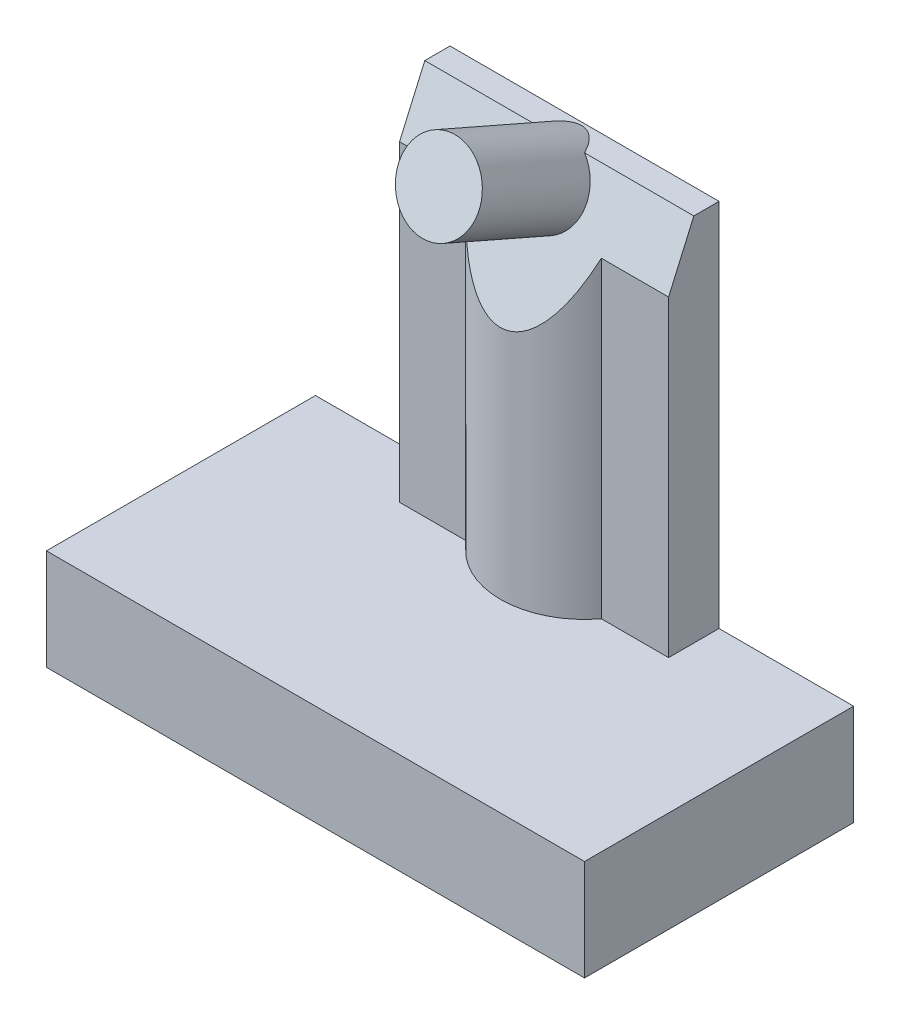
ISO-10303-21;
HEADER;
FILE_DESCRIPTION(('STEP AP214'),'2;1');
FILE_NAME('part.step','',(''),(''),'','','');
FILE_SCHEMA(('AUTOMOTIVE_DESIGN { 1 0 10303 214 1 1 1 1 }'));
ENDSEC;
DATA;
#1=APPLICATION_CONTEXT('core data for automotive mechanical design processes');
#2=APPLICATION_PROTOCOL_DEFINITION('international standard','automotive_design',2000,#1);
#3=PRODUCT_CONTEXT('',#1,'mechanical');
#4=PRODUCT('Part','Part','',(#3));
#5=PRODUCT_RELATED_PRODUCT_CATEGORY('part','',(#4));
#6=PRODUCT_DEFINITION_FORMATION('','',#4);
#7=PRODUCT_DEFINITION_CONTEXT('part definition',#1,'design');
#8=PRODUCT_DEFINITION('design','',#6,#7);
#9=PRODUCT_DEFINITION_SHAPE('','',#8);
#10=(LENGTH_UNIT() NAMED_UNIT(*) SI_UNIT(.MILLI.,.METRE.));
#11=(NAMED_UNIT(*) PLANE_ANGLE_UNIT() SI_UNIT($,.RADIAN.));
#12=(NAMED_UNIT(*) SI_UNIT($,.STERADIAN.) SOLID_ANGLE_UNIT());
#13=UNCERTAINTY_MEASURE_WITH_UNIT(LENGTH_MEASURE(1.E-05),#10,'distance_accuracy_value','');
#14=(GEOMETRIC_REPRESENTATION_CONTEXT(3) GLOBAL_UNCERTAINTY_ASSIGNED_CONTEXT((#13)) GLOBAL_UNIT_ASSIGNED_CONTEXT((#10,
#11,#12)) REPRESENTATION_CONTEXT('',''));
#15=CARTESIAN_POINT('',(0.,0.,0.));
#16=DIRECTION('',(0.,0.,1.));
#17=DIRECTION('',(1.,0.,0.));
#18=AXIS2_PLACEMENT_3D('',#15,#16,#17);
#19=CARTESIAN_POINT('',(0.,0.,0.));
#20=DIRECTION('',(0.,-1.,0.));
#21=DIRECTION('',(0.,0.,-1.));
#22=AXIS2_PLACEMENT_3D('',#19,#20,#21);
#23=PLANE('',#22);
#24=DIRECTION('',(0.,0.,-1.));
#25=VECTOR('',#24,1.);
#26=CARTESIAN_POINT('',(8.,0.,4.));
#27=LINE('',#26,#25);
#28=CARTESIAN_POINT('',(8.,0.,4.));
#29=VERTEX_POINT('',#28);
#30=CARTESIAN_POINT('',(8.,0.,-4.));
#31=VERTEX_POINT('',#30);
#32=EDGE_CURVE('E225',#29,#31,#27,.T.);
#33=ORIENTED_EDGE('',*,*,#32,.F.);
#34=DIRECTION('',(1.,0.,0.));
#35=VECTOR('',#34,1.);
#36=CARTESIAN_POINT('',(-8.,0.,4.));
#37=LINE('',#36,#35);
#38=CARTESIAN_POINT('',(-8.,0.,4.));
#39=VERTEX_POINT('',#38);
#40=EDGE_CURVE('E234',#39,#29,#37,.T.);
#41=ORIENTED_EDGE('',*,*,#40,.F.);
#42=DIRECTION('',(0.,0.,1.));
#43=VECTOR('',#42,1.);
#44=CARTESIAN_POINT('',(-8.,0.,4.));
#45=LINE('',#44,#43);
#46=CARTESIAN_POINT('',(-8.,0.,-4.));
#47=VERTEX_POINT('',#46);
#48=EDGE_CURVE('E224',#47,#39,#45,.T.);
#49=ORIENTED_EDGE('',*,*,#48,.F.);
#50=DIRECTION('',(-1.,0.,0.));
#51=VECTOR('',#50,1.);
#52=CARTESIAN_POINT('',(-8.,0.,-4.));
#53=LINE('',#52,#51);
#54=EDGE_CURVE('E214',#31,#47,#53,.T.);
#55=ORIENTED_EDGE('',*,*,#54,.F.);
#56=EDGE_LOOP('',(#33,#41,#49,#55));
#57=FACE_BOUND('',#56,.T.);
#58=DIRECTION('',(1.,0.,0.));
#59=VECTOR('',#58,1.);
#60=CARTESIAN_POINT('',(0.,0.,3.));
#61=LINE('',#60,#59);
#62=CARTESIAN_POINT('',(-7.,0.,3.));
#63=VERTEX_POINT('',#62);
#64=CARTESIAN_POINT('',(7.,0.,3.));
#65=VERTEX_POINT('',#64);
#66=EDGE_CURVE('E339',#63,#65,#61,.T.);
#67=ORIENTED_EDGE('',*,*,#66,.T.);
#68=DIRECTION('',(0.,0.,-1.));
#69=VECTOR('',#68,1.);
#70=CARTESIAN_POINT('',(7.,0.,0.));
#71=LINE('',#70,#69);
#72=CARTESIAN_POINT('',(7.,0.,-3.));
#73=VERTEX_POINT('',#72);
#74=EDGE_CURVE('E321',#65,#73,#71,.T.);
#75=ORIENTED_EDGE('',*,*,#74,.T.);
#76=DIRECTION('',(-1.,0.,0.));
#77=VECTOR('',#76,1.);
#78=CARTESIAN_POINT('',(0.,0.,-3.));
#79=LINE('',#78,#77);
#80=CARTESIAN_POINT('',(-7.,0.,-3.));
#81=VERTEX_POINT('',#80);
#82=EDGE_CURVE('E360',#73,#81,#79,.T.);
#83=ORIENTED_EDGE('',*,*,#82,.T.);
#84=DIRECTION('',(0.,0.,1.));
#85=VECTOR('',#84,1.);
#86=CARTESIAN_POINT('',(-7.,0.,0.));
#87=LINE('',#86,#85);
#88=EDGE_CURVE('E364',#81,#63,#87,.T.);
#89=ORIENTED_EDGE('',*,*,#88,.T.);
#90=EDGE_LOOP('',(#67,#75,#83,#89));
#91=FACE_BOUND('',#90,.T.);
#92=ADVANCED_FACE('F47',(#57,#91),#23,.T.);
#93=CARTESIAN_POINT('',(8.,3.,4.));
#94=DIRECTION('',(-1.,0.,0.));
#95=DIRECTION('',(0.,0.,1.));
#96=AXIS2_PLACEMENT_3D('',#93,#94,#95);
#97=PLANE('',#96);
#98=ORIENTED_EDGE('',*,*,#32,.T.);
#99=DIRECTION('',(0.,-1.,0.));
#100=VECTOR('',#99,1.);
#101=CARTESIAN_POINT('',(8.,3.,-4.));
#102=LINE('',#101,#100);
#103=CARTESIAN_POINT('',(8.,3.,-4.));
#104=VERTEX_POINT('',#103);
#105=EDGE_CURVE('E220',#104,#31,#102,.T.);
#106=ORIENTED_EDGE('',*,*,#105,.F.);
#107=DIRECTION('',(0.,0.,-1.));
#108=VECTOR('',#107,1.);
#109=CARTESIAN_POINT('',(8.,3.,4.));
#110=LINE('',#109,#108);
#111=CARTESIAN_POINT('',(8.,3.,4.));
#112=VERTEX_POINT('',#111);
#113=EDGE_CURVE('E238',#112,#104,#110,.T.);
#114=ORIENTED_EDGE('',*,*,#113,.F.);
#115=DIRECTION('',(0.,-1.,0.));
#116=VECTOR('',#115,1.);
#117=CARTESIAN_POINT('',(8.,3.,4.));
#118=LINE('',#117,#116);
#119=EDGE_CURVE('E242',#112,#29,#118,.T.);
#120=ORIENTED_EDGE('',*,*,#119,.T.);
#121=EDGE_LOOP('',(#98,#106,#114,#120));
#122=FACE_BOUND('',#121,.T.);
#123=ADVANCED_FACE('F49',(#122),#97,.F.);
#124=CARTESIAN_POINT('',(-8.,3.,-4.));
#125=DIRECTION('',(0.,0.,1.));
#126=DIRECTION('',(1.,0.,0.));
#127=AXIS2_PLACEMENT_3D('',#124,#125,#126);
#128=PLANE('',#127);
#129=ORIENTED_EDGE('',*,*,#54,.T.);
#130=DIRECTION('',(0.,-1.,0.));
#131=VECTOR('',#130,1.);
#132=CARTESIAN_POINT('',(-8.,3.,-4.));
#133=LINE('',#132,#131);
#134=CARTESIAN_POINT('',(-8.,3.,-4.));
#135=VERTEX_POINT('',#134);
#136=EDGE_CURVE('E217',#135,#47,#133,.T.);
#137=ORIENTED_EDGE('',*,*,#136,.F.);
#138=DIRECTION('',(-1.,0.,0.));
#139=VECTOR('',#138,1.);
#140=CARTESIAN_POINT('',(-8.,3.,-4.));
#141=LINE('',#140,#139);
#142=CARTESIAN_POINT('',(-4.,3.,-4.));
#143=VERTEX_POINT('',#142);
#144=EDGE_CURVE('E374',#143,#135,#141,.T.);
#145=ORIENTED_EDGE('',*,*,#144,.F.);
#146=DIRECTION('',(0.,-1.,0.));
#147=VECTOR('',#146,1.);
#148=CARTESIAN_POINT('',(-4.,14.,-4.));
#149=LINE('',#148,#147);
#150=CARTESIAN_POINT('',(-4.,14.,-4.));
#151=VERTEX_POINT('',#150);
#152=EDGE_CURVE('E276',#151,#143,#149,.T.);
#153=ORIENTED_EDGE('',*,*,#152,.F.);
#154=DIRECTION('',(1.,0.,0.));
#155=VECTOR('',#154,1.);
#156=CARTESIAN_POINT('',(-4.,14.,-4.));
#157=LINE('',#156,#155);
#158=CARTESIAN_POINT('',(4.,14.,-4.));
#159=VERTEX_POINT('',#158);
#160=EDGE_CURVE('E271',#151,#159,#157,.T.);
#161=ORIENTED_EDGE('',*,*,#160,.T.);
#162=DIRECTION('',(0.,-1.,0.));
#163=VECTOR('',#162,1.);
#164=CARTESIAN_POINT('',(4.,14.,-4.));
#165=LINE('',#164,#163);
#166=CARTESIAN_POINT('',(4.,3.,-4.));
#167=VERTEX_POINT('',#166);
#168=EDGE_CURVE('E303',#159,#167,#165,.T.);
#169=ORIENTED_EDGE('',*,*,#168,.T.);
#170=EDGE_CURVE('E375',#104,#167,#141,.T.);
#171=ORIENTED_EDGE('',*,*,#170,.F.);
#172=ORIENTED_EDGE('',*,*,#105,.T.);
#173=EDGE_LOOP('',(#129,#137,#145,#153,#161,#169,#171,#172));
#174=FACE_BOUND('',#173,.T.);
#175=ADVANCED_FACE('F192',(#174),#128,.F.);
#176=CARTESIAN_POINT('',(-8.,3.,4.));
#177=DIRECTION('',(1.,0.,0.));
#178=DIRECTION('',(0.,0.,-1.));
#179=AXIS2_PLACEMENT_3D('',#176,#177,#178);
#180=PLANE('',#179);
#181=ORIENTED_EDGE('',*,*,#48,.T.);
#182=DIRECTION('',(0.,-1.,0.));
#183=VECTOR('',#182,1.);
#184=CARTESIAN_POINT('',(-8.,3.,4.));
#185=LINE('',#184,#183);
#186=CARTESIAN_POINT('',(-8.,3.,4.));
#187=VERTEX_POINT('',#186);
#188=EDGE_CURVE('E231',#187,#39,#185,.T.);
#189=ORIENTED_EDGE('',*,*,#188,.F.);
#190=DIRECTION('',(0.,0.,1.));
#191=VECTOR('',#190,1.);
#192=CARTESIAN_POINT('',(-8.,3.,4.));
#193=LINE('',#192,#191);
#194=EDGE_CURVE('E229',#135,#187,#193,.T.);
#195=ORIENTED_EDGE('',*,*,#194,.F.);
#196=ORIENTED_EDGE('',*,*,#136,.T.);
#197=EDGE_LOOP('',(#181,#189,#195,#196));
#198=FACE_BOUND('',#197,.T.);
#199=ADVANCED_FACE('F202',(#198),#180,.F.);
#200=CARTESIAN_POINT('',(-8.,3.,4.));
#201=DIRECTION('',(0.,0.,-1.));
#202=DIRECTION('',(-1.,0.,0.));
#203=AXIS2_PLACEMENT_3D('',#200,#201,#202);
#204=PLANE('',#203);
#205=ORIENTED_EDGE('',*,*,#40,.T.);
#206=ORIENTED_EDGE('',*,*,#119,.F.);
#207=DIRECTION('',(1.,0.,0.));
#208=VECTOR('',#207,1.);
#209=CARTESIAN_POINT('',(-8.,3.,4.));
#210=LINE('',#209,#208);
#211=EDGE_CURVE('E246',#187,#112,#210,.T.);
#212=ORIENTED_EDGE('',*,*,#211,.F.);
#213=ORIENTED_EDGE('',*,*,#188,.T.);
#214=EDGE_LOOP('',(#205,#206,#212,#213));
#215=FACE_BOUND('',#214,.T.);
#216=ADVANCED_FACE('F200',(#215),#204,.F.);
#217=CARTESIAN_POINT('',(0.,3.,0.));
#218=DIRECTION('',(0.,-1.,0.));
#219=DIRECTION('',(0.,0.,-1.));
#220=AXIS2_PLACEMENT_3D('',#217,#218,#219);
#221=PLANE('',#220);
#222=DIRECTION('',(0.,0.,1.));
#223=VECTOR('',#222,1.);
#224=CARTESIAN_POINT('',(-4.,3.,-4.));
#225=LINE('',#224,#223);
#226=CARTESIAN_POINT('',(-4.,3.,-2.5));
#227=VERTEX_POINT('',#226);
#228=EDGE_CURVE('E298',#143,#227,#225,.T.);
#229=ORIENTED_EDGE('',*,*,#228,.F.);
#230=ORIENTED_EDGE('',*,*,#144,.T.);
#231=ORIENTED_EDGE('',*,*,#194,.T.);
#232=ORIENTED_EDGE('',*,*,#211,.T.);
#233=ORIENTED_EDGE('',*,*,#113,.T.);
#234=ORIENTED_EDGE('',*,*,#170,.T.);
#235=DIRECTION('',(0.,0.,1.));
#236=VECTOR('',#235,1.);
#237=CARTESIAN_POINT('',(4.,3.,-4.));
#238=LINE('',#237,#236);
#239=CARTESIAN_POINT('',(4.,3.,-2.5));
#240=VERTEX_POINT('',#239);
#241=EDGE_CURVE('E294',#167,#240,#238,.T.);
#242=ORIENTED_EDGE('',*,*,#241,.T.);
#243=DIRECTION('',(-1.,0.,0.));
#244=VECTOR('',#243,1.);
#245=CARTESIAN_POINT('',(4.,3.,-2.5));
#246=LINE('',#245,#244);
#247=CARTESIAN_POINT('',(2.,3.,-2.5));
#248=VERTEX_POINT('',#247);
#249=EDGE_CURVE('E290',#240,#248,#246,.T.);
#250=ORIENTED_EDGE('',*,*,#249,.T.);
#251=CARTESIAN_POINT('',(0.,3.,-4.));
#252=DIRECTION('',(0.,1.,0.));
#253=DIRECTION('',(0.,0.,1.));
#254=AXIS2_PLACEMENT_3D('',#251,#252,#253);
#255=CIRCLE('',#254,2.5);
#256=CARTESIAN_POINT('',(-2.,3.,-2.5));
#257=VERTEX_POINT('',#256);
#258=EDGE_CURVE('E286',#257,#248,#255,.T.);
#259=ORIENTED_EDGE('',*,*,#258,.F.);
#260=DIRECTION('',(1.,0.,0.));
#261=VECTOR('',#260,1.);
#262=CARTESIAN_POINT('',(-4.,3.,-2.5));
#263=LINE('',#262,#261);
#264=EDGE_CURVE('E282',#227,#257,#263,.T.);
#265=ORIENTED_EDGE('',*,*,#264,.F.);
#266=EDGE_LOOP('',(#229,#230,#231,#232,#233,#234,#242,#250,#259,#265));
#267=FACE_BOUND('',#266,.T.);
#268=ADVANCED_FACE('F198',(#267),#221,.F.);
#269=CARTESIAN_POINT('',(7.,3.,4.));
#270=DIRECTION('',(-1.,0.,0.));
#271=DIRECTION('',(0.,0.,1.));
#272=AXIS2_PLACEMENT_3D('',#269,#270,#271);
#273=PLANE('',#272);
#274=ORIENTED_EDGE('',*,*,#74,.F.);
#275=DIRECTION('',(0.,-1.,0.));
#276=VECTOR('',#275,1.);
#277=CARTESIAN_POINT('',(7.,3.,3.));
#278=LINE('',#277,#276);
#279=CARTESIAN_POINT('',(7.,2.,3.));
#280=VERTEX_POINT('',#279);
#281=EDGE_CURVE('E340',#280,#65,#278,.T.);
#282=ORIENTED_EDGE('',*,*,#281,.F.);
#283=DIRECTION('',(0.,0.,-1.));
#284=VECTOR('',#283,1.);
#285=CARTESIAN_POINT('',(7.,2.,0.));
#286=LINE('',#285,#284);
#287=CARTESIAN_POINT('',(7.,2.,-3.));
#288=VERTEX_POINT('',#287);
#289=EDGE_CURVE('E334',#280,#288,#286,.T.);
#290=ORIENTED_EDGE('',*,*,#289,.T.);
#291=DIRECTION('',(0.,-1.,0.));
#292=VECTOR('',#291,1.);
#293=CARTESIAN_POINT('',(7.,3.,-3.));
#294=LINE('',#293,#292);
#295=EDGE_CURVE('E329',#288,#73,#294,.T.);
#296=ORIENTED_EDGE('',*,*,#295,.T.);
#297=EDGE_LOOP('',(#274,#282,#290,#296));
#298=FACE_BOUND('',#297,.T.);
#299=ADVANCED_FACE('F562',(#298),#273,.T.);
#300=CARTESIAN_POINT('',(-8.,3.,-3.));
#301=DIRECTION('',(0.,0.,1.));
#302=DIRECTION('',(1.,0.,0.));
#303=AXIS2_PLACEMENT_3D('',#300,#301,#302);
#304=PLANE('',#303);
#305=ORIENTED_EDGE('',*,*,#82,.F.);
#306=ORIENTED_EDGE('',*,*,#295,.F.);
#307=DIRECTION('',(-1.,0.,0.));
#308=VECTOR('',#307,1.);
#309=CARTESIAN_POINT('',(0.,2.,-3.));
#310=LINE('',#309,#308);
#311=CARTESIAN_POINT('',(-7.,2.,-3.));
#312=VERTEX_POINT('',#311);
#313=EDGE_CURVE('E338',#288,#312,#310,.T.);
#314=ORIENTED_EDGE('',*,*,#313,.T.);
#315=DIRECTION('',(0.,-1.,0.));
#316=VECTOR('',#315,1.);
#317=CARTESIAN_POINT('',(-7.,3.,-3.));
#318=LINE('',#317,#316);
#319=EDGE_CURVE('E333',#312,#81,#318,.T.);
#320=ORIENTED_EDGE('',*,*,#319,.T.);
#321=EDGE_LOOP('',(#305,#306,#314,#320));
#322=FACE_BOUND('',#321,.T.);
#323=ADVANCED_FACE('F552',(#322),#304,.T.);
#324=CARTESIAN_POINT('',(-7.,3.,4.));
#325=DIRECTION('',(1.,0.,0.));
#326=DIRECTION('',(0.,0.,-1.));
#327=AXIS2_PLACEMENT_3D('',#324,#325,#326);
#328=PLANE('',#327);
#329=ORIENTED_EDGE('',*,*,#88,.F.);
#330=ORIENTED_EDGE('',*,*,#319,.F.);
#331=DIRECTION('',(0.,0.,1.));
#332=VECTOR('',#331,1.);
#333=CARTESIAN_POINT('',(-7.,2.,0.));
#334=LINE('',#333,#332);
#335=CARTESIAN_POINT('',(-7.,2.,3.));
#336=VERTEX_POINT('',#335);
#337=EDGE_CURVE('E350',#312,#336,#334,.T.);
#338=ORIENTED_EDGE('',*,*,#337,.T.);
#339=DIRECTION('',(0.,-1.,0.));
#340=VECTOR('',#339,1.);
#341=CARTESIAN_POINT('',(-7.,3.,3.));
#342=LINE('',#341,#340);
#343=EDGE_CURVE('E343',#336,#63,#342,.T.);
#344=ORIENTED_EDGE('',*,*,#343,.T.);
#345=EDGE_LOOP('',(#329,#330,#338,#344));
#346=FACE_BOUND('',#345,.T.);
#347=ADVANCED_FACE('F542',(#346),#328,.T.);
#348=CARTESIAN_POINT('',(-8.,3.,3.));
#349=DIRECTION('',(0.,0.,-1.));
#350=DIRECTION('',(-1.,0.,0.));
#351=AXIS2_PLACEMENT_3D('',#348,#349,#350);
#352=PLANE('',#351);
#353=ORIENTED_EDGE('',*,*,#66,.F.);
#354=ORIENTED_EDGE('',*,*,#343,.F.);
#355=DIRECTION('',(1.,0.,0.));
#356=VECTOR('',#355,1.);
#357=CARTESIAN_POINT('',(0.,2.,3.));
#358=LINE('',#357,#356);
#359=EDGE_CURVE('E344',#336,#280,#358,.T.);
#360=ORIENTED_EDGE('',*,*,#359,.T.);
#361=ORIENTED_EDGE('',*,*,#281,.T.);
#362=EDGE_LOOP('',(#353,#354,#360,#361));
#363=FACE_BOUND('',#362,.T.);
#364=ADVANCED_FACE('F533',(#363),#352,.T.);
#365=CARTESIAN_POINT('',(0.,2.,0.));
#366=DIRECTION('',(0.,-1.,0.));
#367=DIRECTION('',(0.,0.,-1.));
#368=AXIS2_PLACEMENT_3D('',#365,#366,#367);
#369=PLANE('',#368);
#370=CARTESIAN_POINT('',(0.,2.,0.));
#371=DIRECTION('',(0.,-1.,0.));
#372=DIRECTION('',(0.,0.,-1.));
#373=AXIS2_PLACEMENT_3D('',#370,#371,#372);
#374=CIRCLE('',#373,1.5);
#375=CARTESIAN_POINT('',(0.,2.,-1.5));
#376=VERTEX_POINT('',#375);
#377=EDGE_CURVE('E322',#376,#376,#374,.T.);
#378=ORIENTED_EDGE('',*,*,#377,.F.);
#379=EDGE_LOOP('',(#378));
#380=FACE_BOUND('',#379,.T.);
#381=ORIENTED_EDGE('',*,*,#289,.F.);
#382=ORIENTED_EDGE('',*,*,#359,.F.);
#383=ORIENTED_EDGE('',*,*,#337,.F.);
#384=ORIENTED_EDGE('',*,*,#313,.F.);
#385=EDGE_LOOP('',(#381,#382,#383,#384));
#386=FACE_BOUND('',#385,.T.);
#387=ADVANCED_FACE('F517',(#380,#386),#369,.T.);
#388=CARTESIAN_POINT('',(0.,-4.24264068711929,0.));
#389=DIRECTION('',(0.,1.,0.));
#390=DIRECTION('',(0.,0.,1.));
#391=AXIS2_PLACEMENT_3D('',#388,#389,#390);
#392=CYLINDRICAL_SURFACE('',#391,1.5);
#393=ORIENTED_EDGE('',*,*,#377,.T.);
#394=EDGE_LOOP('',(#393));
#395=FACE_BOUND('',#394,.T.);
#396=CARTESIAN_POINT('',(0.,0.,0.));
#397=DIRECTION('',(0.,-1.,0.));
#398=DIRECTION('',(0.,0.,-1.));
#399=AXIS2_PLACEMENT_3D('',#396,#397,#398);
#400=CIRCLE('',#399,1.5);
#401=CARTESIAN_POINT('',(0.,0.,-1.5));
#402=VERTEX_POINT('',#401);
#403=EDGE_CURVE('E317',#402,#402,#400,.T.);
#404=ORIENTED_EDGE('',*,*,#403,.F.);
#405=EDGE_LOOP('',(#404));
#406=FACE_BOUND('',#405,.T.);
#407=ADVANCED_FACE('F508',(#395,#406),#392,.T.);
#408=CARTESIAN_POINT('',(0.,-4.24264068711929,0.));
#409=DIRECTION('',(0.,1.,0.));
#410=DIRECTION('',(0.,0.,1.));
#411=AXIS2_PLACEMENT_3D('',#408,#409,#410);
#412=CYLINDRICAL_SURFACE('',#411,0.8);
#413=CARTESIAN_POINT('',(0.,2.,0.));
#414=DIRECTION('',(0.,-1.,0.));
#415=DIRECTION('',(0.,0.,-1.));
#416=AXIS2_PLACEMENT_3D('',#413,#414,#415);
#417=CIRCLE('',#416,0.8);
#418=CARTESIAN_POINT('',(0.,2.,-0.8));
#419=VERTEX_POINT('',#418);
#420=EDGE_CURVE('E250',#419,#419,#417,.F.);
#421=ORIENTED_EDGE('',*,*,#420,.T.);
#422=EDGE_LOOP('',(#421));
#423=FACE_BOUND('',#422,.T.);
#424=CARTESIAN_POINT('',(0.,0.,0.));
#425=DIRECTION('',(0.,-1.,0.));
#426=DIRECTION('',(0.,0.,-1.));
#427=AXIS2_PLACEMENT_3D('',#424,#425,#426);
#428=CIRCLE('',#427,0.8);
#429=CARTESIAN_POINT('',(0.,0.,-0.8));
#430=VERTEX_POINT('',#429);
#431=EDGE_CURVE('E316',#430,#430,#428,.T.);
#432=ORIENTED_EDGE('',*,*,#431,.T.);
#433=EDGE_LOOP('',(#432));
#434=FACE_BOUND('',#433,.T.);
#435=ADVANCED_FACE('F498',(#423,#434),#412,.F.);
#436=CARTESIAN_POINT('',(0.,0.,0.));
#437=DIRECTION('',(0.,-1.,0.));
#438=DIRECTION('',(0.,0.,-1.));
#439=AXIS2_PLACEMENT_3D('',#436,#437,#438);
#440=PLANE('',#439);
#441=ORIENTED_EDGE('',*,*,#431,.F.);
#442=EDGE_LOOP('',(#441));
#443=FACE_BOUND('',#442,.T.);
#444=ORIENTED_EDGE('',*,*,#403,.T.);
#445=EDGE_LOOP('',(#444));
#446=FACE_BOUND('',#445,.T.);
#447=ADVANCED_FACE('F493',(#443,#446),#440,.T.);
#448=ORIENTED_EDGE('',*,*,#420,.F.);
#449=EDGE_LOOP('',(#448));
#450=FACE_BOUND('',#449,.T.);
#451=ADVANCED_FACE('F479',(#450),#369,.T.);
#452=CARTESIAN_POINT('',(-4.,14.,-2.5));
#453=DIRECTION('',(0.,0.,-1.));
#454=DIRECTION('',(-1.,0.,0.));
#455=AXIS2_PLACEMENT_3D('',#452,#453,#454);
#456=PLANE('',#455);
#457=DIRECTION('',(0.,-1.,0.));
#458=VECTOR('',#457,1.);
#459=CARTESIAN_POINT('',(-2.,14.,-2.5));
#460=LINE('',#459,#458);
#461=CARTESIAN_POINT('',(-2.,12.2857142857143,-2.5));
#462=VERTEX_POINT('',#461);
#463=EDGE_CURVE('E313',#462,#257,#460,.T.);
#464=ORIENTED_EDGE('',*,*,#463,.F.);
#465=DIRECTION('',(-1.,0.,0.));
#466=VECTOR('',#465,1.);
#467=CARTESIAN_POINT('',(-4.,12.2857142857143,-2.5));
#468=LINE('',#467,#466);
#469=CARTESIAN_POINT('',(-4.,12.2857142857143,-2.5));
#470=VERTEX_POINT('',#469);
#471=EDGE_CURVE('E268',#462,#470,#468,.T.);
#472=ORIENTED_EDGE('',*,*,#471,.T.);
#473=DIRECTION('',(0.,-1.,0.));
#474=VECTOR('',#473,1.);
#475=CARTESIAN_POINT('',(-4.,14.,-2.5));
#476=LINE('',#475,#474);
#477=EDGE_CURVE('E266',#470,#227,#476,.T.);
#478=ORIENTED_EDGE('',*,*,#477,.T.);
#479=ORIENTED_EDGE('',*,*,#264,.T.);
#480=EDGE_LOOP('',(#464,#472,#478,#479));
#481=FACE_BOUND('',#480,.T.);
#482=ADVANCED_FACE('F404',(#481),#456,.F.);
#483=CARTESIAN_POINT('',(0.,14.,-4.));
#484=DIRECTION('',(0.,-1.,0.));
#485=DIRECTION('',(0.,0.,-1.));
#486=AXIS2_PLACEMENT_3D('',#483,#484,#485);
#487=CYLINDRICAL_SURFACE('',#486,2.5);
#488=CARTESIAN_POINT('',(0.,15.7142857142857,-4.));
#489=DIRECTION('',(0.,-0.400818834019708,-0.916157334902189));
#490=DIRECTION('',(0.,-0.916157334902189,0.400818834019708));
#491=AXIS2_PLACEMENT_3D('',#488,#489,#490);
#492=ELLIPSE('',#491,6.23723185591891,2.5);
#493=CARTESIAN_POINT('',(2.,12.2857142857143,-2.5));
#494=VERTEX_POINT('',#493);
#495=EDGE_CURVE('E401',#494,#462,#492,.T.);
#496=ORIENTED_EDGE('',*,*,#495,.T.);
#497=ORIENTED_EDGE('',*,*,#463,.T.);
#498=ORIENTED_EDGE('',*,*,#258,.T.);
#499=DIRECTION('',(0.,-1.,0.));
#500=VECTOR('',#499,1.);
#501=CARTESIAN_POINT('',(2.,14.,-2.5));
#502=LINE('',#501,#500);
#503=EDGE_CURVE('E310',#494,#248,#502,.T.);
#504=ORIENTED_EDGE('',*,*,#503,.F.);
#505=EDGE_LOOP('',(#496,#497,#498,#504));
#506=FACE_BOUND('',#505,.T.);
#507=ADVANCED_FACE('F400',(#506),#487,.T.);
#508=CARTESIAN_POINT('',(4.,14.,-2.5));
#509=DIRECTION('',(0.,0.,1.));
#510=DIRECTION('',(1.,0.,0.));
#511=AXIS2_PLACEMENT_3D('',#508,#509,#510);
#512=PLANE('',#511);
#513=DIRECTION('',(1.,0.,0.));
#514=VECTOR('',#513,1.);
#515=CARTESIAN_POINT('',(4.,12.2857142857143,-2.5));
#516=LINE('',#515,#514);
#517=CARTESIAN_POINT('',(4.,12.2857142857143,-2.5));
#518=VERTEX_POINT('',#517);
#519=EDGE_CURVE('E398',#494,#518,#516,.T.);
#520=ORIENTED_EDGE('',*,*,#519,.F.);
#521=ORIENTED_EDGE('',*,*,#503,.T.);
#522=ORIENTED_EDGE('',*,*,#249,.F.);
#523=DIRECTION('',(0.,-1.,0.));
#524=VECTOR('',#523,1.);
#525=CARTESIAN_POINT('',(4.,14.,-2.5));
#526=LINE('',#525,#524);
#527=EDGE_CURVE('E307',#518,#240,#526,.T.);
#528=ORIENTED_EDGE('',*,*,#527,.F.);
#529=EDGE_LOOP('',(#520,#521,#522,#528));
#530=FACE_BOUND('',#529,.T.);
#531=ADVANCED_FACE('F396',(#530),#512,.T.);
#532=CARTESIAN_POINT('',(4.,14.,-4.));
#533=DIRECTION('',(1.,0.,0.));
#534=DIRECTION('',(0.,0.,-1.));
#535=AXIS2_PLACEMENT_3D('',#532,#533,#534);
#536=PLANE('',#535);
#537=DIRECTION('',(0.,0.916157334902189,-0.400818834019708));
#538=VECTOR('',#537,1.);
#539=CARTESIAN_POINT('',(4.,14.2754098360656,-3.37049180327869));
#540=LINE('',#539,#538);
#541=CARTESIAN_POINT('',(4.,14.,-3.25));
#542=VERTEX_POINT('',#541);
#543=EDGE_CURVE('E69',#518,#542,#540,.T.);
#544=ORIENTED_EDGE('',*,*,#543,.F.);
#545=ORIENTED_EDGE('',*,*,#527,.T.);
#546=ORIENTED_EDGE('',*,*,#241,.F.);
#547=ORIENTED_EDGE('',*,*,#168,.F.);
#548=DIRECTION('',(0.,0.,1.));
#549=VECTOR('',#548,1.);
#550=CARTESIAN_POINT('',(4.,14.,-4.));
#551=LINE('',#550,#549);
#552=EDGE_CURVE('E278',#159,#542,#551,.T.);
#553=ORIENTED_EDGE('',*,*,#552,.T.);
#554=EDGE_LOOP('',(#544,#545,#546,#547,#553));
#555=FACE_BOUND('',#554,.T.);
#556=ADVANCED_FACE('F390',(#555),#536,.T.);
#557=CARTESIAN_POINT('',(-4.,14.,-4.));
#558=DIRECTION('',(1.,0.,0.));
#559=DIRECTION('',(0.,0.,-1.));
#560=AXIS2_PLACEMENT_3D('',#557,#558,#559);
#561=PLANE('',#560);
#562=ORIENTED_EDGE('',*,*,#477,.F.);
#563=DIRECTION('',(0.,0.916157334902189,-0.400818834019708));
#564=VECTOR('',#563,1.);
#565=CARTESIAN_POINT('',(-4.,14.2754098360656,-3.37049180327869));
#566=LINE('',#565,#564);
#567=CARTESIAN_POINT('',(-4.,14.,-3.25));
#568=VERTEX_POINT('',#567);
#569=EDGE_CURVE('E171',#470,#568,#566,.T.);
#570=ORIENTED_EDGE('',*,*,#569,.T.);
#571=DIRECTION('',(0.,0.,1.));
#572=VECTOR('',#571,1.);
#573=CARTESIAN_POINT('',(-4.,14.,-4.));
#574=LINE('',#573,#572);
#575=EDGE_CURVE('E263',#151,#568,#574,.T.);
#576=ORIENTED_EDGE('',*,*,#575,.F.);
#577=ORIENTED_EDGE('',*,*,#152,.T.);
#578=ORIENTED_EDGE('',*,*,#228,.T.);
#579=EDGE_LOOP('',(#562,#570,#576,#577,#578));
#580=FACE_BOUND('',#579,.T.);
#581=ADVANCED_FACE('F182',(#580),#561,.F.);
#582=CARTESIAN_POINT('',(0.,14.,-4.));
#583=DIRECTION('',(0.,1.,0.));
#584=DIRECTION('',(0.,0.,1.));
#585=AXIS2_PLACEMENT_3D('',#582,#583,#584);
#586=PLANE('',#585);
#587=CARTESIAN_POINT('',(0.,14.,-0.915816326530633));
#588=DIRECTION('',(0.,1.,0.));
#589=DIRECTION('',(0.,0.,1.));
#590=AXIS2_PLACEMENT_3D('',#587,#588,#589);
#591=ELLIPSE('',#590,2.99387129084108,1.2);
#592=CARTESIAN_POINT('',(-0.751452674789963,14.,-3.25));
#593=VERTEX_POINT('',#592);
#594=CARTESIAN_POINT('',(0.751452674789963,14.,-3.25));
#595=VERTEX_POINT('',#594);
#596=EDGE_CURVE('E62',#593,#595,#591,.F.);
#597=ORIENTED_EDGE('',*,*,#596,.T.);
#598=DIRECTION('',(-1.,0.,0.));
#599=VECTOR('',#598,1.);
#600=CARTESIAN_POINT('',(0.,14.,-3.25));
#601=LINE('',#600,#599);
#602=EDGE_CURVE('E11',#542,#595,#601,.T.);
#603=ORIENTED_EDGE('',*,*,#602,.F.);
#604=ORIENTED_EDGE('',*,*,#552,.F.);
#605=ORIENTED_EDGE('',*,*,#160,.F.);
#606=ORIENTED_EDGE('',*,*,#575,.T.);
#607=EDGE_CURVE('E56',#593,#568,#601,.T.);
#608=ORIENTED_EDGE('',*,*,#607,.F.);
#609=EDGE_LOOP('',(#597,#603,#604,#605,#606,#608));
#610=FACE_BOUND('',#609,.T.);
#611=ADVANCED_FACE('F166',(#610),#586,.T.);
#612=CARTESIAN_POINT('',(-8.,10.,-1.5));
#613=DIRECTION('',(0.,-0.400818834019708,-0.916157334902189));
#614=DIRECTION('',(0.,0.916157334902189,-0.400818834019708));
#615=AXIS2_PLACEMENT_3D('',#612,#613,#614);
#616=PLANE('',#615);
#617=ORIENTED_EDGE('',*,*,#602,.T.);
#618=CARTESIAN_POINT('',(0.,13.1428571428571,-2.875));
#619=DIRECTION('',(0.,0.400818834019708,0.916157334902189));
#620=DIRECTION('',(0.,-0.916157334902189,0.400818834019708));
#621=AXIS2_PLACEMENT_3D('',#618,#619,#620);
#622=CIRCLE('',#621,1.2);
#623=EDGE_CURVE('E158',#593,#595,#622,.T.);
#624=ORIENTED_EDGE('',*,*,#623,.F.);
#625=ORIENTED_EDGE('',*,*,#607,.T.);
#626=ORIENTED_EDGE('',*,*,#569,.F.);
#627=ORIENTED_EDGE('',*,*,#471,.F.);
#628=ORIENTED_EDGE('',*,*,#495,.F.);
#629=ORIENTED_EDGE('',*,*,#519,.T.);
#630=ORIENTED_EDGE('',*,*,#543,.T.);
#631=EDGE_LOOP('',(#617,#624,#625,#626,#627,#628,#629,#630));
#632=FACE_BOUND('',#631,.T.);
#633=ADVANCED_FACE('F173',(#632),#616,.F.);
#634=CARTESIAN_POINT('',(0.,10.6174653412547,-8.6473241179485));
#635=DIRECTION('',(0.,0.400818834019708,0.916157334902189));
#636=DIRECTION('',(0.,-0.916157334902189,0.400818834019708));
#637=AXIS2_PLACEMENT_3D('',#634,#635,#636);
#638=CYLINDRICAL_SURFACE('',#637,1.2);
#639=ORIENTED_EDGE('',*,*,#596,.F.);
#640=ORIENTED_EDGE('',*,*,#623,.T.);
#641=EDGE_LOOP('',(#639,#640));
#642=FACE_BOUND('',#641,.T.);
#643=CARTESIAN_POINT('',(0.,14.5457230619261,0.331550672157658));
#644=DIRECTION('',(0.,0.400818834019708,0.916157334902189));
#645=DIRECTION('',(0.,-0.916157334902189,0.400818834019708));
#646=AXIS2_PLACEMENT_3D('',#643,#644,#645);
#647=CIRCLE('',#646,1.2);
#648=CARTESIAN_POINT('',(0.,13.4463342600435,0.812533272981308));
#649=VERTEX_POINT('',#648);
#650=EDGE_CURVE('E163',#649,#649,#647,.T.);
#651=ORIENTED_EDGE('',*,*,#650,.F.);
#652=EDGE_LOOP('',(#651));
#653=FACE_BOUND('',#652,.T.);
#654=ADVANCED_FACE('F159',(#642,#653),#638,.T.);
#655=CARTESIAN_POINT('',(0.,14.5457230619261,0.331550672157658));
#656=DIRECTION('',(0.,0.400818834019708,0.916157334902189));
#657=DIRECTION('',(0.,-0.916157334902189,0.400818834019708));
#658=AXIS2_PLACEMENT_3D('',#655,#656,#657);
#659=PLANE('',#658);
#660=ORIENTED_EDGE('',*,*,#650,.T.);
#661=EDGE_LOOP('',(#660));
#662=FACE_BOUND('',#661,.T.);
#663=ADVANCED_FACE('F180',(#662),#659,.T.);
#664=CLOSED_SHELL('',(#92,#123,#175,#199,#216,#268,#299,#323,#347,#364,#387,#407,#435,#447,#451,
#482,#507,#531,#556,#581,#611,#633,#654,#663));
#665=MANIFOLD_SOLID_BREP('B2',#664);
#666=ADVANCED_BREP_SHAPE_REPRESENTATION('',(#18,#665),#14);
#667=SHAPE_DEFINITION_REPRESENTATION(#9,#666);
ENDSEC;
END-ISO-10303-21;
